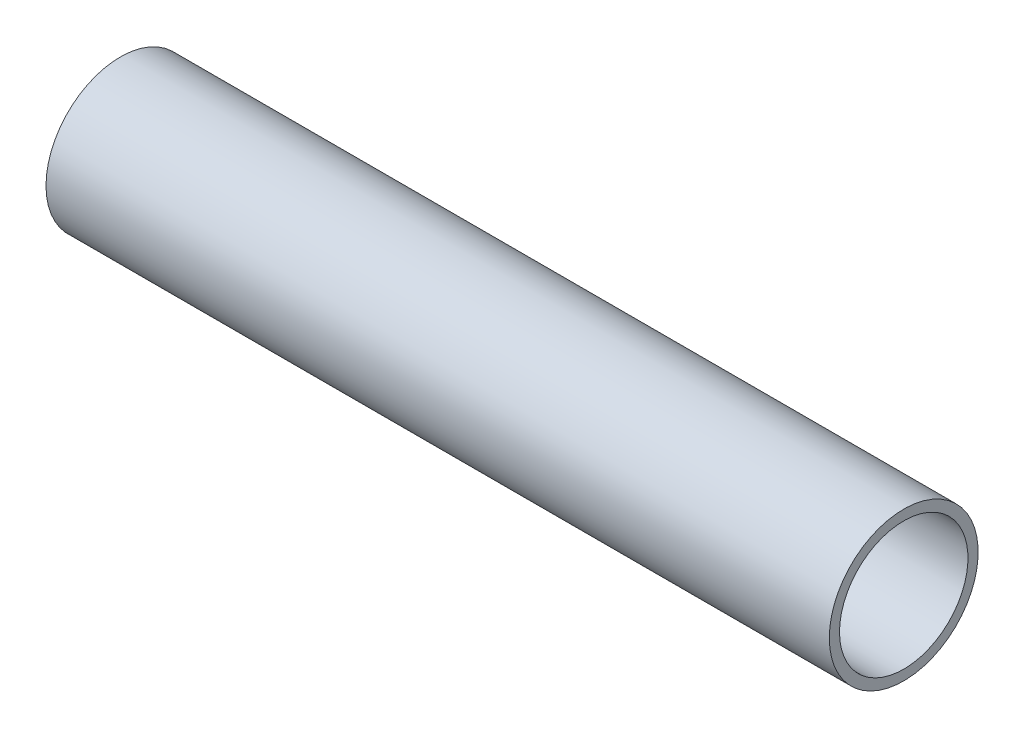
ISO-10303-21;
HEADER;
FILE_DESCRIPTION(('STEP AP214'),'2;1');
FILE_NAME('part.step','',(''),(''),'','','');
FILE_SCHEMA(('AUTOMOTIVE_DESIGN { 1 0 10303 214 1 1 1 1 }'));
ENDSEC;
DATA;
#1=APPLICATION_CONTEXT('core data for automotive mechanical design processes');
#2=APPLICATION_PROTOCOL_DEFINITION('international standard','automotive_design',2000,#1);
#3=PRODUCT_CONTEXT('',#1,'mechanical');
#4=PRODUCT('Part','Part','',(#3));
#5=PRODUCT_RELATED_PRODUCT_CATEGORY('part','',(#4));
#6=PRODUCT_DEFINITION_FORMATION('','',#4);
#7=PRODUCT_DEFINITION_CONTEXT('part definition',#1,'design');
#8=PRODUCT_DEFINITION('design','',#6,#7);
#9=PRODUCT_DEFINITION_SHAPE('','',#8);
#10=(LENGTH_UNIT() NAMED_UNIT(*) SI_UNIT(.MILLI.,.METRE.));
#11=(NAMED_UNIT(*) PLANE_ANGLE_UNIT() SI_UNIT($,.RADIAN.));
#12=(NAMED_UNIT(*) SI_UNIT($,.STERADIAN.) SOLID_ANGLE_UNIT());
#13=UNCERTAINTY_MEASURE_WITH_UNIT(LENGTH_MEASURE(1.E-05),#10,'distance_accuracy_value','');
#14=(GEOMETRIC_REPRESENTATION_CONTEXT(3) GLOBAL_UNCERTAINTY_ASSIGNED_CONTEXT((#13)) GLOBAL_UNIT_ASSIGNED_CONTEXT((#10,
#11,#12)) REPRESENTATION_CONTEXT('',''));
#15=CARTESIAN_POINT('',(0.,0.,0.));
#16=DIRECTION('',(0.,0.,1.));
#17=DIRECTION('',(1.,0.,0.));
#18=AXIS2_PLACEMENT_3D('',#15,#16,#17);
#19=CARTESIAN_POINT('',(100.,0.,0.));
#20=DIRECTION('',(1.,0.,0.));
#21=DIRECTION('',(0.,0.,1.));
#22=AXIS2_PLACEMENT_3D('',#19,#20,#21);
#23=PLANE('',#22);
#24=CARTESIAN_POINT('',(100.,0.,0.));
#25=DIRECTION('',(-1.,0.,0.));
#26=DIRECTION('',(0.,0.,1.));
#27=AXIS2_PLACEMENT_3D('',#24,#25,#26);
#28=CIRCLE('',#27,9.5);
#29=CARTESIAN_POINT('',(100.,0.,9.5));
#30=VERTEX_POINT('',#29);
#31=EDGE_CURVE('E10',#30,#30,#28,.T.);
#32=ORIENTED_EDGE('',*,*,#31,.F.);
#33=EDGE_LOOP('',(#32));
#34=FACE_BOUND('',#33,.T.);
#35=CARTESIAN_POINT('',(100.,0.,0.));
#36=DIRECTION('',(-1.,0.,0.));
#37=DIRECTION('',(0.,0.,1.));
#38=AXIS2_PLACEMENT_3D('',#35,#36,#37);
#39=CIRCLE('',#38,8.2);
#40=CARTESIAN_POINT('',(100.,0.,8.2));
#41=VERTEX_POINT('',#40);
#42=EDGE_CURVE('E44',#41,#41,#39,.T.);
#43=ORIENTED_EDGE('',*,*,#42,.T.);
#44=EDGE_LOOP('',(#43));
#45=FACE_BOUND('',#44,.T.);
#46=ADVANCED_FACE('F33',(#34,#45),#23,.T.);
#47=CARTESIAN_POINT('',(0.,0.,0.));
#48=DIRECTION('',(1.,0.,0.));
#49=DIRECTION('',(0.,0.,1.));
#50=AXIS2_PLACEMENT_3D('',#47,#48,#49);
#51=PLANE('',#50);
#52=CARTESIAN_POINT('',(0.,0.,0.));
#53=DIRECTION('',(-1.,0.,0.));
#54=DIRECTION('',(0.,0.,1.));
#55=AXIS2_PLACEMENT_3D('',#52,#53,#54);
#56=CIRCLE('',#55,9.5);
#57=CARTESIAN_POINT('',(0.,0.,9.5));
#58=VERTEX_POINT('',#57);
#59=EDGE_CURVE('E37',#58,#58,#56,.T.);
#60=ORIENTED_EDGE('',*,*,#59,.T.);
#61=EDGE_LOOP('',(#60));
#62=FACE_BOUND('',#61,.T.);
#63=CARTESIAN_POINT('',(0.,0.,0.));
#64=DIRECTION('',(-1.,0.,0.));
#65=DIRECTION('',(0.,0.,1.));
#66=AXIS2_PLACEMENT_3D('',#63,#64,#65);
#67=CIRCLE('',#66,8.2);
#68=CARTESIAN_POINT('',(0.,0.,8.2));
#69=VERTEX_POINT('',#68);
#70=EDGE_CURVE('E46',#69,#69,#67,.T.);
#71=ORIENTED_EDGE('',*,*,#70,.F.);
#72=EDGE_LOOP('',(#71));
#73=FACE_BOUND('',#72,.T.);
#74=ADVANCED_FACE('F59',(#62,#73),#51,.F.);
#75=CARTESIAN_POINT('',(100.,0.,0.));
#76=DIRECTION('',(-1.,0.,0.));
#77=DIRECTION('',(0.,0.,-1.));
#78=AXIS2_PLACEMENT_3D('',#75,#76,#77);
#79=CYLINDRICAL_SURFACE('',#78,9.5);
#80=ORIENTED_EDGE('',*,*,#31,.T.);
#81=EDGE_LOOP('',(#80));
#82=FACE_BOUND('',#81,.T.);
#83=ORIENTED_EDGE('',*,*,#59,.F.);
#84=EDGE_LOOP('',(#83));
#85=FACE_BOUND('',#84,.T.);
#86=ADVANCED_FACE('F35',(#82,#85),#79,.T.);
#87=CARTESIAN_POINT('',(100.,0.,0.));
#88=DIRECTION('',(-1.,0.,0.));
#89=DIRECTION('',(0.,0.,-1.));
#90=AXIS2_PLACEMENT_3D('',#87,#88,#89);
#91=CYLINDRICAL_SURFACE('',#90,8.2);
#92=ORIENTED_EDGE('',*,*,#42,.F.);
#93=EDGE_LOOP('',(#92));
#94=FACE_BOUND('',#93,.T.);
#95=ORIENTED_EDGE('',*,*,#70,.T.);
#96=EDGE_LOOP('',(#95));
#97=FACE_BOUND('',#96,.T.);
#98=ADVANCED_FACE('F53',(#94,#97),#91,.F.);
#99=CLOSED_SHELL('',(#46,#74,#86,#98));
#100=MANIFOLD_SOLID_BREP('B2',#99);
#101=ADVANCED_BREP_SHAPE_REPRESENTATION('',(#18,#100),#14);
#102=SHAPE_DEFINITION_REPRESENTATION(#9,#101);
ENDSEC;
END-ISO-10303-21;
